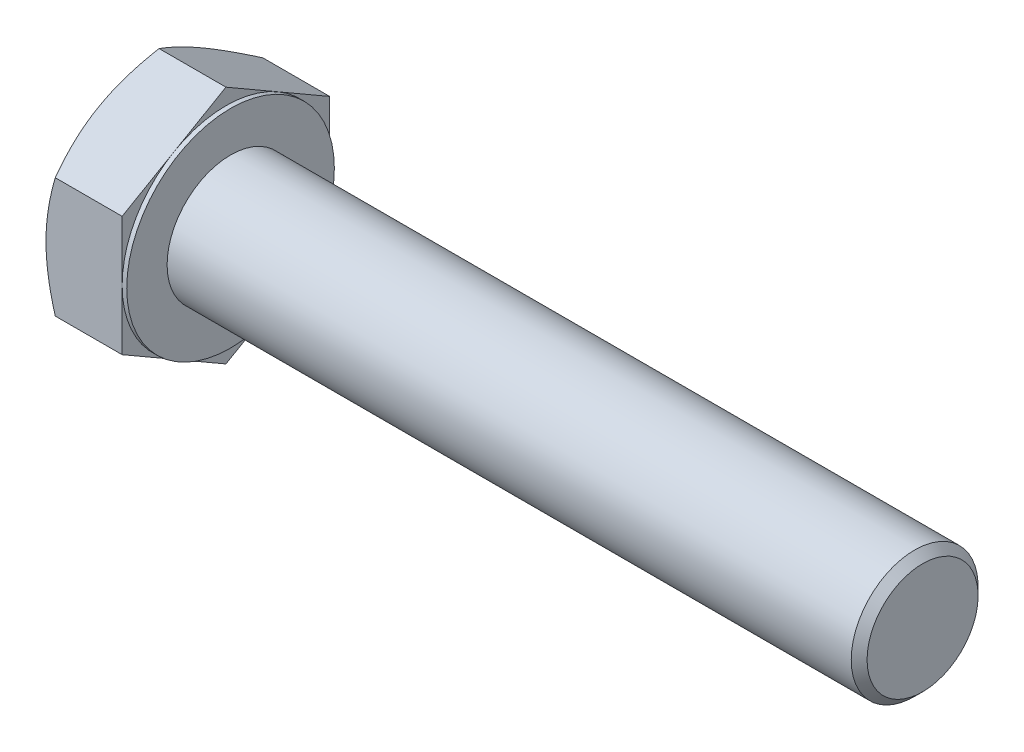
ISO-10303-21;
HEADER;
FILE_DESCRIPTION(('STEP AP214'),'2;1');
FILE_NAME('part.step','',(''),(''),'','','');
FILE_SCHEMA(('AUTOMOTIVE_DESIGN { 1 0 10303 214 1 1 1 1 }'));
ENDSEC;
DATA;
#1=APPLICATION_CONTEXT('core data for automotive mechanical design processes');
#2=APPLICATION_PROTOCOL_DEFINITION('international standard','automotive_design',2000,#1);
#3=PRODUCT_CONTEXT('',#1,'mechanical');
#4=PRODUCT('Part','Part','',(#3));
#5=PRODUCT_RELATED_PRODUCT_CATEGORY('part','',(#4));
#6=PRODUCT_DEFINITION_FORMATION('','',#4);
#7=PRODUCT_DEFINITION_CONTEXT('part definition',#1,'design');
#8=PRODUCT_DEFINITION('design','',#6,#7);
#9=PRODUCT_DEFINITION_SHAPE('','',#8);
#10=(LENGTH_UNIT() NAMED_UNIT(*) SI_UNIT(.MILLI.,.METRE.));
#11=(NAMED_UNIT(*) PLANE_ANGLE_UNIT() SI_UNIT($,.RADIAN.));
#12=(NAMED_UNIT(*) SI_UNIT($,.STERADIAN.) SOLID_ANGLE_UNIT());
#13=UNCERTAINTY_MEASURE_WITH_UNIT(LENGTH_MEASURE(1.E-05),#10,'distance_accuracy_value','');
#14=(GEOMETRIC_REPRESENTATION_CONTEXT(3) GLOBAL_UNCERTAINTY_ASSIGNED_CONTEXT((#13)) GLOBAL_UNIT_ASSIGNED_CONTEXT((#10,
#11,#12)) REPRESENTATION_CONTEXT('',''));
#15=CARTESIAN_POINT('',(0.,0.,0.));
#16=DIRECTION('',(0.,0.,1.));
#17=DIRECTION('',(1.,0.,0.));
#18=AXIS2_PLACEMENT_3D('',#15,#16,#17);
#19=CARTESIAN_POINT('',(14.,20.7846096908265,0.));
#20=DIRECTION('',(1.,0.,0.));
#21=DIRECTION('',(0.,0.,-1.));
#22=AXIS2_PLACEMENT_3D('',#19,#20,#21);
#23=PLANE('',#22);
#24=CARTESIAN_POINT('',(14.,0.,0.));
#25=DIRECTION('',(1.,0.,0.));
#26=DIRECTION('',(0.,0.,-1.));
#27=AXIS2_PLACEMENT_3D('',#24,#25,#26);
#28=CIRCLE('',#27,11.);
#29=CARTESIAN_POINT('',(14.,0.,-11.));
#30=VERTEX_POINT('',#29);
#31=EDGE_CURVE('E273',#30,#30,#28,.F.);
#32=ORIENTED_EDGE('',*,*,#31,.T.);
#33=EDGE_LOOP('',(#32));
#34=FACE_BOUND('',#33,.T.);
#35=CARTESIAN_POINT('',(14.,0.,0.));
#36=DIRECTION('',(1.,0.,0.));
#37=DIRECTION('',(0.,0.,-1.));
#38=AXIS2_PLACEMENT_3D('',#35,#36,#37);
#39=CIRCLE('',#38,18.);
#40=CARTESIAN_POINT('',(14.,0.,-18.));
#41=VERTEX_POINT('',#40);
#42=EDGE_CURVE('E292',#41,#41,#39,.T.);
#43=ORIENTED_EDGE('',*,*,#42,.T.);
#44=EDGE_LOOP('',(#43));
#45=FACE_BOUND('',#44,.T.);
#46=ADVANCED_FACE('F35',(#34,#45),#23,.T.);
#47=CARTESIAN_POINT('',(0.,0.,0.));
#48=DIRECTION('',(-1.,0.,0.));
#49=DIRECTION('',(0.,0.,1.));
#50=AXIS2_PLACEMENT_3D('',#47,#48,#49);
#51=CYLINDRICAL_SURFACE('',#50,11.);
#52=ORIENTED_EDGE('',*,*,#31,.F.);
#53=EDGE_LOOP('',(#52));
#54=FACE_BOUND('',#53,.T.);
#55=CARTESIAN_POINT('',(132.626,0.,0.));
#56=DIRECTION('',(-1.,0.,0.));
#57=DIRECTION('',(0.,0.,1.));
#58=AXIS2_PLACEMENT_3D('',#55,#56,#57);
#59=CIRCLE('',#58,11.);
#60=CARTESIAN_POINT('',(132.626,0.,11.));
#61=VERTEX_POINT('',#60);
#62=EDGE_CURVE('E270',#61,#61,#59,.T.);
#63=ORIENTED_EDGE('',*,*,#62,.T.);
#64=EDGE_LOOP('',(#63));
#65=FACE_BOUND('',#64,.T.);
#66=ADVANCED_FACE('F244',(#54,#65),#51,.T.);
#67=CARTESIAN_POINT('',(134.,0.,0.));
#68=DIRECTION('',(-1.,0.,0.));
#69=DIRECTION('',(0.,0.,1.));
#70=AXIS2_PLACEMENT_3D('',#67,#68,#69);
#71=CONICAL_SURFACE('',#70,9.626,0.785398163397433);
#72=ORIENTED_EDGE('',*,*,#62,.F.);
#73=EDGE_LOOP('',(#72));
#74=FACE_BOUND('',#73,.T.);
#75=CARTESIAN_POINT('',(134.,0.,0.));
#76=DIRECTION('',(-1.,0.,0.));
#77=DIRECTION('',(0.,0.,1.));
#78=AXIS2_PLACEMENT_3D('',#75,#76,#77);
#79=CIRCLE('',#78,9.626);
#80=CARTESIAN_POINT('',(134.,0.,9.626));
#81=VERTEX_POINT('',#80);
#82=EDGE_CURVE('E268',#81,#81,#79,.T.);
#83=ORIENTED_EDGE('',*,*,#82,.T.);
#84=EDGE_LOOP('',(#83));
#85=FACE_BOUND('',#84,.T.);
#86=ADVANCED_FACE('F249',(#74,#85),#71,.T.);
#87=CARTESIAN_POINT('',(134.,0.,0.));
#88=DIRECTION('',(-1.,0.,0.));
#89=DIRECTION('',(0.,0.,1.));
#90=AXIS2_PLACEMENT_3D('',#87,#88,#89);
#91=PLANE('',#90);
#92=ORIENTED_EDGE('',*,*,#82,.F.);
#93=EDGE_LOOP('',(#92));
#94=FACE_BOUND('',#93,.T.);
#95=ADVANCED_FACE('F256',(#94),#91,.F.);
#96=CARTESIAN_POINT('',(13.2,18.,0.));
#97=DIRECTION('',(1.,0.,0.));
#98=DIRECTION('',(0.,0.,-1.));
#99=AXIS2_PLACEMENT_3D('',#96,#97,#98);
#100=PLANE('',#99);
#101=DIRECTION('',(0.,0.500000000000001,0.866025403784438));
#102=VECTOR('',#101,1.);
#103=CARTESIAN_POINT('',(13.2,10.3923048454133,-18.));
#104=LINE('',#103,#102);
#105=CARTESIAN_POINT('',(13.2,10.3923048454133,-18.));
#106=VERTEX_POINT('',#105);
#107=CARTESIAN_POINT('',(13.2,15.5884572681199,-9.00000000000001));
#108=VERTEX_POINT('',#107);
#109=EDGE_CURVE('E168',#106,#108,#104,.T.);
#110=ORIENTED_EDGE('',*,*,#109,.T.);
#111=CARTESIAN_POINT('',(13.2,0.,0.));
#112=DIRECTION('',(-1.,0.,0.));
#113=DIRECTION('',(0.,0.,1.));
#114=AXIS2_PLACEMENT_3D('',#111,#112,#113);
#115=CIRCLE('',#114,18.);
#116=CARTESIAN_POINT('',(13.2,0.,-18.));
#117=VERTEX_POINT('',#116);
#118=EDGE_CURVE('E51',#108,#117,#115,.T.);
#119=ORIENTED_EDGE('',*,*,#118,.T.);
#120=DIRECTION('',(0.,1.,0.));
#121=VECTOR('',#120,1.);
#122=CARTESIAN_POINT('',(13.2,10.3923048454133,-18.));
#123=LINE('',#122,#121);
#124=EDGE_CURVE('E40',#117,#106,#123,.T.);
#125=ORIENTED_EDGE('',*,*,#124,.T.);
#126=EDGE_LOOP('',(#110,#119,#125));
#127=FACE_BOUND('',#126,.T.);
#128=ADVANCED_FACE('F259',(#127),#100,.T.);
#129=CARTESIAN_POINT('',(13.2,20.7846096908265,0.));
#130=VERTEX_POINT('',#129);
#131=EDGE_CURVE('E166',#108,#130,#104,.T.);
#132=ORIENTED_EDGE('',*,*,#131,.T.);
#133=DIRECTION('',(0.,-0.500000000000001,0.866025403784438));
#134=VECTOR('',#133,1.);
#135=CARTESIAN_POINT('',(13.2,20.7846096908265,0.));
#136=LINE('',#135,#134);
#137=CARTESIAN_POINT('',(13.2,15.5884572681199,9.00000000000001));
#138=VERTEX_POINT('',#137);
#139=EDGE_CURVE('E165',#130,#138,#136,.T.);
#140=ORIENTED_EDGE('',*,*,#139,.T.);
#141=EDGE_CURVE('E154',#138,#108,#115,.T.);
#142=ORIENTED_EDGE('',*,*,#141,.T.);
#143=EDGE_LOOP('',(#132,#140,#142));
#144=FACE_BOUND('',#143,.T.);
#145=ADVANCED_FACE('F264',(#144),#100,.T.);
#146=CARTESIAN_POINT('',(13.2,10.3923048454133,18.));
#147=VERTEX_POINT('',#146);
#148=EDGE_CURVE('E133',#138,#147,#136,.T.);
#149=ORIENTED_EDGE('',*,*,#148,.T.);
#150=DIRECTION('',(0.,-1.,0.));
#151=VECTOR('',#150,1.);
#152=CARTESIAN_POINT('',(13.2,10.3923048454133,18.));
#153=LINE('',#152,#151);
#154=CARTESIAN_POINT('',(13.2,0.,18.));
#155=VERTEX_POINT('',#154);
#156=EDGE_CURVE('E127',#147,#155,#153,.T.);
#157=ORIENTED_EDGE('',*,*,#156,.T.);
#158=EDGE_CURVE('E131',#155,#138,#115,.T.);
#159=ORIENTED_EDGE('',*,*,#158,.T.);
#160=EDGE_LOOP('',(#149,#157,#159));
#161=FACE_BOUND('',#160,.T.);
#162=ADVANCED_FACE('F129',(#161),#100,.T.);
#163=CARTESIAN_POINT('',(13.2,-10.3923048454133,18.));
#164=VERTEX_POINT('',#163);
#165=EDGE_CURVE('E137',#155,#164,#153,.T.);
#166=ORIENTED_EDGE('',*,*,#165,.T.);
#167=DIRECTION('',(0.,-0.500000000000001,-0.866025403784438));
#168=VECTOR('',#167,1.);
#169=CARTESIAN_POINT('',(13.2,-20.7846096908266,0.));
#170=LINE('',#169,#168);
#171=CARTESIAN_POINT('',(13.2,-15.5884572681199,9.00000000000002));
#172=VERTEX_POINT('',#171);
#173=EDGE_CURVE('E144',#164,#172,#170,.T.);
#174=ORIENTED_EDGE('',*,*,#173,.T.);
#175=EDGE_CURVE('E141',#172,#155,#115,.T.);
#176=ORIENTED_EDGE('',*,*,#175,.T.);
#177=EDGE_LOOP('',(#166,#174,#176));
#178=FACE_BOUND('',#177,.T.);
#179=ADVANCED_FACE('F142',(#178),#100,.T.);
#180=CARTESIAN_POINT('',(13.2,-20.7846096908266,0.));
#181=VERTEX_POINT('',#180);
#182=EDGE_CURVE('E160',#172,#181,#170,.T.);
#183=ORIENTED_EDGE('',*,*,#182,.T.);
#184=DIRECTION('',(0.,0.500000000000001,-0.866025403784438));
#185=VECTOR('',#184,1.);
#186=CARTESIAN_POINT('',(13.2,-10.3923048454133,-18.));
#187=LINE('',#186,#185);
#188=CARTESIAN_POINT('',(13.2,-15.5884572681199,-9.00000000000001));
#189=VERTEX_POINT('',#188);
#190=EDGE_CURVE('E328',#181,#189,#187,.T.);
#191=ORIENTED_EDGE('',*,*,#190,.T.);
#192=EDGE_CURVE('E148',#189,#172,#115,.T.);
#193=ORIENTED_EDGE('',*,*,#192,.T.);
#194=EDGE_LOOP('',(#183,#191,#193));
#195=FACE_BOUND('',#194,.T.);
#196=ADVANCED_FACE('F333',(#195),#100,.T.);
#197=CARTESIAN_POINT('',(13.2,-10.3923048454133,-18.));
#198=VERTEX_POINT('',#197);
#199=EDGE_CURVE('E155',#189,#198,#187,.T.);
#200=ORIENTED_EDGE('',*,*,#199,.T.);
#201=EDGE_CURVE('E11',#198,#117,#123,.T.);
#202=ORIENTED_EDGE('',*,*,#201,.T.);
#203=EDGE_CURVE('E346',#117,#189,#115,.T.);
#204=ORIENTED_EDGE('',*,*,#203,.T.);
#205=EDGE_LOOP('',(#200,#202,#204));
#206=FACE_BOUND('',#205,.T.);
#207=ADVANCED_FACE('F265',(#206),#100,.T.);
#208=CARTESIAN_POINT('',(0.,0.,0.));
#209=DIRECTION('',(-1.,0.,0.));
#210=DIRECTION('',(0.,0.,1.));
#211=AXIS2_PLACEMENT_3D('',#208,#209,#210);
#212=CYLINDRICAL_SURFACE('',#211,18.);
#213=ORIENTED_EDGE('',*,*,#118,.F.);
#214=ORIENTED_EDGE('',*,*,#141,.F.);
#215=ORIENTED_EDGE('',*,*,#158,.F.);
#216=ORIENTED_EDGE('',*,*,#175,.F.);
#217=ORIENTED_EDGE('',*,*,#192,.F.);
#218=ORIENTED_EDGE('',*,*,#203,.F.);
#219=EDGE_LOOP('',(#213,#214,#215,#216,#217,#218));
#220=FACE_BOUND('',#219,.T.);
#221=ORIENTED_EDGE('',*,*,#42,.F.);
#222=EDGE_LOOP('',(#221));
#223=FACE_BOUND('',#222,.T.);
#224=ADVANCED_FACE('F151',(#220,#223),#212,.T.);
#225=CARTESIAN_POINT('',(0.,20.7846096908265,0.));
#226=DIRECTION('',(1.,0.,0.));
#227=DIRECTION('',(0.,0.,-1.));
#228=AXIS2_PLACEMENT_3D('',#225,#226,#227);
#229=PLANE('',#228);
#230=CARTESIAN_POINT('',(0.,0.,0.));
#231=DIRECTION('',(1.,0.,0.));
#232=DIRECTION('',(0.,0.,-1.));
#233=AXIS2_PLACEMENT_3D('',#230,#231,#232);
#234=CIRCLE('',#233,18.);
#235=CARTESIAN_POINT('',(0.,0.,-18.));
#236=VERTEX_POINT('',#235);
#237=CARTESIAN_POINT('',(0.,15.5884572681199,-9.00000000000001));
#238=VERTEX_POINT('',#237);
#239=EDGE_CURVE('E291',#236,#238,#234,.T.);
#240=ORIENTED_EDGE('',*,*,#239,.F.);
#241=CARTESIAN_POINT('',(0.,-15.5884572681199,-9.00000000000001));
#242=VERTEX_POINT('',#241);
#243=EDGE_CURVE('E288',#242,#236,#234,.T.);
#244=ORIENTED_EDGE('',*,*,#243,.F.);
#245=CARTESIAN_POINT('',(0.,-15.5884572681199,9.00000000000001));
#246=VERTEX_POINT('',#245);
#247=EDGE_CURVE('E290',#246,#242,#234,.T.);
#248=ORIENTED_EDGE('',*,*,#247,.F.);
#249=CARTESIAN_POINT('',(0.,0.,18.));
#250=VERTEX_POINT('',#249);
#251=EDGE_CURVE('E300',#250,#246,#234,.T.);
#252=ORIENTED_EDGE('',*,*,#251,.F.);
#253=CARTESIAN_POINT('',(0.,0.,0.));
#254=DIRECTION('',(-1.,0.,0.));
#255=DIRECTION('',(0.,0.,1.));
#256=AXIS2_PLACEMENT_3D('',#253,#254,#255);
#257=CIRCLE('',#256,18.);
#258=CARTESIAN_POINT('',(0.,15.5884572681199,9.00000000000001));
#259=VERTEX_POINT('',#258);
#260=EDGE_CURVE('E169',#250,#259,#257,.T.);
#261=ORIENTED_EDGE('',*,*,#260,.T.);
#262=EDGE_CURVE('E295',#238,#259,#234,.T.);
#263=ORIENTED_EDGE('',*,*,#262,.F.);
#264=EDGE_LOOP('',(#240,#244,#248,#252,#261,#263));
#265=FACE_BOUND('',#264,.T.);
#266=ADVANCED_FACE('F198',(#265),#229,.F.);
#267=CARTESIAN_POINT('',(0.,0.,0.));
#268=DIRECTION('',(1.,0.,0.));
#269=DIRECTION('',(0.,0.,-1.));
#270=AXIS2_PLACEMENT_3D('',#267,#268,#269);
#271=CONICAL_SURFACE('',#270,18.,1.0471975511966);
#272=CARTESIAN_POINT('',(1.60776182180894,10.3921893753594,18.0002));
#273=CARTESIAN_POINT('',(1.47589336556313,10.6206079566545,17.6045674118041));
#274=CARTESIAN_POINT('',(1.35000889021179,10.8499174930169,17.2073916441644));
#275=CARTESIAN_POINT('',(1.11187123611098,11.310375356009,16.4098552307175));
#276=CARTESIAN_POINT('',(0.999622540659328,11.5415242609305,16.0094935832795));
#277=CARTESIAN_POINT('',(0.790265297583964,12.0061075993295,15.2048116368224));
#278=CARTESIAN_POINT('',(0.693192573141012,12.2395460983593,14.8004842960602));
#279=CARTESIAN_POINT('',(0.516271743787662,12.7080451523823,13.9890201311945));
#280=CARTESIAN_POINT('',(0.436422652420741,12.9431056136839,13.5818834693696));
#281=CARTESIAN_POINT('',(0.297345302854858,13.4088255484441,12.7752328802672));
#282=CARTESIAN_POINT('',(0.237656723113627,13.6394504469968,12.3757788384836));
#283=CARTESIAN_POINT('',(0.13757237566945,14.1017570002651,11.5750403995507));
#284=CARTESIAN_POINT('',(0.0971769793251384,14.3334386752352,11.1737559673198));
#285=CARTESIAN_POINT('',(0.0366989588175672,14.7971912077607,10.370513018847));
#286=CARTESIAN_POINT('',(0.016592197038854,15.0292612730516,9.96855587484737));
#287=CARTESIAN_POINT('',(-0.00287614600258716,15.4936156120144,9.16427056704863));
#288=CARTESIAN_POINT('',(-0.00223836829112098,15.7258998788456,8.76194241509821));
#289=CARTESIAN_POINT('',(0.018333579496385,16.1601606713826,8.00978065868889));
#290=CARTESIAN_POINT('',(0.0357591844006531,16.3621681381522,7.65989346273577));
#291=CARTESIAN_POINT('',(0.0859690685012238,16.765701206145,6.96095368643809));
#292=CARTESIAN_POINT('',(0.118753127736275,16.9672268142278,6.61190109421242));
#293=CARTESIAN_POINT('',(0.199111057578687,17.3697198122039,5.91476277202716));
#294=CARTESIAN_POINT('',(0.246698302564832,17.5706865308241,5.56667820474646));
#295=CARTESIAN_POINT('',(0.355822876567444,17.9716632799777,4.87216610255867));
#296=CARTESIAN_POINT('',(0.417360146472637,18.1716733145612,4.52573856063651));
#297=CARTESIAN_POINT('',(0.624462075708565,18.7788295665707,3.47411308402299));
#298=CARTESIAN_POINT('',(0.790677467933148,19.1842175215698,2.77196054918802));
#299=CARTESIAN_POINT('',(1.1679181702988,19.9889486858692,1.37812528618742));
#300=CARTESIAN_POINT('',(1.3788548871277,20.3883021980098,0.686424712978887));
#301=CARTESIAN_POINT('',(1.60776182180895,20.7847251608804,-0.000199999999999422));
#302=B_SPLINE_CURVE_WITH_KNOTS('',3,(#272,#273,#274,#275,#276,#277,#278,#279,#280,#281,#282,
#283,#284,#285,#286,#287,#288,#289,#290,#291,#292,#293,#294,#295,#296,#297,#298,#299,#300,#301),
.UNSPECIFIED.,.F.,.F.,(4,2,2,2,2,2,2,2,2,2,2,2,2,2,4),(0.,1.42650335783821,2.85347447244912,
4.28376471280637,5.71397301377358,7.10888071673008,8.5038152680368,9.8970882864255,
11.2903182514067,12.5031974791544,13.7160593367767,14.9300201888636,16.1439758970578,
18.6253607678546,21.1018751738864),.UNSPECIFIED.);
#303=CARTESIAN_POINT('',(1.60769515458674,20.7846096908265,0.));
#304=VERTEX_POINT('',#303);
#305=EDGE_CURVE('E216',#259,#304,#302,.T.);
#306=ORIENTED_EDGE('',*,*,#305,.T.);
#307=CARTESIAN_POINT('',(1.60776182180895,20.7847251608804,0.0002));
#308=CARTESIAN_POINT('',(1.47589336556314,20.5563065795853,-0.39543258819589));
#309=CARTESIAN_POINT('',(1.3500088902118,20.3269970432229,-0.792608355835561));
#310=CARTESIAN_POINT('',(1.11187123611099,19.8665391802308,-1.59014476928247));
#311=CARTESIAN_POINT('',(0.999622540659338,19.6353902753093,-1.99050641672051));
#312=CARTESIAN_POINT('',(0.790265297583974,19.1708069369103,-2.79518836317755));
#313=CARTESIAN_POINT('',(0.693192573141022,18.9373684378805,-3.19951570393979));
#314=CARTESIAN_POINT('',(0.516271743787671,18.4688693838575,-4.01097986880547));
#315=CARTESIAN_POINT('',(0.436422652420748,18.2338089225559,-4.41811653063043));
#316=CARTESIAN_POINT('',(0.297345302854863,17.7680889877957,-5.22476711973284));
#317=CARTESIAN_POINT('',(0.237656723113632,17.537464089243,-5.62422116151643));
#318=CARTESIAN_POINT('',(0.137572375669453,17.0751575359747,-6.42495960044929));
#319=CARTESIAN_POINT('',(0.0971769793251405,16.8434758610046,-6.82624403268018));
#320=CARTESIAN_POINT('',(0.0366989588175682,16.3797233284791,-7.62948698115295));
#321=CARTESIAN_POINT('',(0.0165921970388556,16.1476532631882,-8.03144412515262));
#322=CARTESIAN_POINT('',(-0.00287614600258678,15.6832989242254,-8.83572943295137));
#323=CARTESIAN_POINT('',(-0.00223836829112223,15.4510146573942,-9.23805758490179));
#324=CARTESIAN_POINT('',(0.0183335794963823,15.0167538648572,-9.99021934131111));
#325=CARTESIAN_POINT('',(0.0357591844006503,14.8147463980876,-10.3401065372642));
#326=CARTESIAN_POINT('',(0.0859690685012205,14.4112133300948,-11.0390463135619));
#327=CARTESIAN_POINT('',(0.118753127736271,14.209687722012,-11.3880989057876));
#328=CARTESIAN_POINT('',(0.199111057578683,13.8071947240359,-12.0852372279728));
#329=CARTESIAN_POINT('',(0.246698302564828,13.6062280054157,-12.4333217952535));
#330=CARTESIAN_POINT('',(0.355822876567439,13.2052512562621,-13.1278338974413));
#331=CARTESIAN_POINT('',(0.417360146472629,13.0052412216786,-13.4742614393635));
#332=CARTESIAN_POINT('',(0.624462075708554,12.3980849696691,-14.525886915977));
#333=CARTESIAN_POINT('',(0.790677467933137,11.99269701467,-15.228039450812));
#334=CARTESIAN_POINT('',(1.16791817029879,11.1879658503706,-16.6218747138126));
#335=CARTESIAN_POINT('',(1.37885488712769,10.78861233823,-17.3135752870211));
#336=CARTESIAN_POINT('',(1.60776182180894,10.3921893753594,-18.0002));
#337=B_SPLINE_CURVE_WITH_KNOTS('',3,(#307,#308,#309,#310,#311,#312,#313,#314,#315,#316,#317,
#318,#319,#320,#321,#322,#323,#324,#325,#326,#327,#328,#329,#330,#331,#332,#333,#334,#335,#336),
.UNSPECIFIED.,.F.,.F.,(4,2,2,2,2,2,2,2,2,2,2,2,2,2,4),(0.,1.42650335783821,2.85347447244912,
4.28376471280638,5.71397301377359,7.10888071673009,8.50381526803681,9.8970882864255,
11.2903182514068,12.5031974791544,13.7160593367768,14.9300201888636,16.1439758970578,
18.6253607678546,21.1018751738864),.UNSPECIFIED.);
#338=EDGE_CURVE('E59',#304,#238,#337,.T.);
#339=ORIENTED_EDGE('',*,*,#338,.T.);
#340=ORIENTED_EDGE('',*,*,#262,.T.);
#341=EDGE_LOOP('',(#306,#339,#340));
#342=FACE_BOUND('',#341,.T.);
#343=ADVANCED_FACE('F342',(#342),#271,.T.);
#344=CARTESIAN_POINT('',(8.80842713097471,-27.9643402440907,18.));
#345=CARTESIAN_POINT('',(8.61750677849099,-27.5710662083654,18.));
#346=CARTESIAN_POINT('',(8.42753472778146,-27.1773320242562,18.));
#347=CARTESIAN_POINT('',(8.04970189935704,-26.3888473529655,18.));
#348=CARTESIAN_POINT('',(7.86184114273206,-25.9940968556801,18.));
#349=CARTESIAN_POINT('',(7.30169863386395,-24.8080724642775,18.));
#350=CARTESIAN_POINT('',(6.93291289437432,-24.0151412260899,18.));
#351=CARTESIAN_POINT('',(6.20490967187156,-22.4196974035044,18.));
#352=CARTESIAN_POINT('',(5.84575478315001,-21.6171561889331,18.));
#353=CARTESIAN_POINT('',(5.1420706468777,-20.0057089280707,18.));
#354=CARTESIAN_POINT('',(4.79754071174434,-19.196803183128,18.));
#355=CARTESIAN_POINT('',(4.11611022279456,-17.5450041871963,18.));
#356=CARTESIAN_POINT('',(3.7798180950293,-16.7018586275441,18.));
#357=CARTESIAN_POINT('',(3.1325651480111,-15.005715432528,18.));
#358=CARTESIAN_POINT('',(2.82160716503417,-14.1527167062286,18.));
#359=CARTESIAN_POINT('',(2.23315455027017,-12.4371186738844,18.));
#360=CARTESIAN_POINT('',(1.95559259445028,-11.5745426463558,18.));
#361=CARTESIAN_POINT('',(1.44279031202514,-9.83693542734509,18.));
#362=CARTESIAN_POINT('',(1.20753670688335,-8.96190823704618,18.));
#363=CARTESIAN_POINT('',(0.895522308081284,-7.64230427811238,18.));
#364=CARTESIAN_POINT('',(0.798539960323232,-7.20248011875152,18.));
#365=CARTESIAN_POINT('',(0.619346663982094,-6.31981731440451,18.));
#366=CARTESIAN_POINT('',(0.537135413908953,-5.87697873113671,18.));
#367=CARTESIAN_POINT('',(0.388933808111684,-4.988597027818,18.));
#368=CARTESIAN_POINT('',(0.322942911230493,-4.54305399850342,18.));
#369=CARTESIAN_POINT('',(0.208492383558029,-3.64970631084203,18.));
#370=CARTESIAN_POINT('',(0.1600327413294,-3.2019016539709,18.));
#371=CARTESIAN_POINT('',(0.0822220075103934,-2.31054962915722,18.));
#372=CARTESIAN_POINT('',(0.052628371700907,-1.86702356450905,18.));
#373=CARTESIAN_POINT('',(0.0122265392038568,-0.979118128574119,18.));
#374=CARTESIAN_POINT('',(0.00141802962903811,-0.534738771623319,18.));
#375=CARTESIAN_POINT('',(-0.00115631761626654,0.354079707284697,18.));
#376=CARTESIAN_POINT('',(0.00707792062379335,0.798518829473095,18.));
#377=CARTESIAN_POINT('',(0.0423876675602117,1.68665283547366,18.));
#378=CARTESIAN_POINT('',(0.0694640211674184,2.13034768501706,18.));
#379=CARTESIAN_POINT('',(0.156482092986642,3.19520589130289,18.));
#380=CARTESIAN_POINT('',(0.225281528451192,3.81565824233054,18.));
#381=CARTESIAN_POINT('',(0.395990058481247,5.05199420629768,18.));
#382=CARTESIAN_POINT('',(0.497903614697511,5.66787719213724,18.));
#383=CARTESIAN_POINT('',(0.731215030447438,6.89447554343314,18.));
#384=CARTESIAN_POINT('',(0.86263576958385,7.50518651517417,18.));
#385=CARTESIAN_POINT('',(1.15094813722315,8.72049972428945,18.));
#386=CARTESIAN_POINT('',(1.30783938963271,9.32510205172292,18.));
#387=CARTESIAN_POINT('',(1.64698004801114,10.5414936476874,18.));
#388=CARTESIAN_POINT('',(1.82971242014998,11.1531473236693,18.));
#389=CARTESIAN_POINT('',(2.21414736103885,12.3704299759813,18.));
#390=CARTESIAN_POINT('',(2.4158500545846,12.9760589126488,18.));
#391=CARTESIAN_POINT('',(2.83501520678354,14.1815895187405,18.));
#392=CARTESIAN_POINT('',(3.05247247546213,14.781493001241,18.));
#393=CARTESIAN_POINT('',(3.50057968381538,15.9763233436138,18.));
#394=CARTESIAN_POINT('',(3.73122947173864,16.5712502606407,18.));
#395=CARTESIAN_POINT('',(4.28861115056411,17.9702204866667,18.));
#396=CARTESIAN_POINT('',(4.62002515688316,18.7723954689383,18.));
#397=CARTESIAN_POINT('',(5.29890820173807,20.3699430833353,18.));
#398=CARTESIAN_POINT('',(5.64637822370813,21.1653152952441,18.));
#399=CARTESIAN_POINT('',(6.3541728667099,22.750516728457,18.));
#400=CARTESIAN_POINT('',(6.71450033452646,23.5403446752873,18.));
#401=CARTESIAN_POINT('',(7.44542750488467,25.1152008422836,18.));
#402=CARTESIAN_POINT('',(7.81602698959445,25.9002291638017,18.));
#403=CARTESIAN_POINT('',(8.56599428657224,27.4671332627904,18.));
#404=CARTESIAN_POINT('',(8.94537123397526,28.2490046603126,18.));
#405=CARTESIAN_POINT('',(9.71100797406294,29.8093695501392,18.));
#406=CARTESIAN_POINT('',(10.0972677961479,30.5878630279972,18.));
#407=CARTESIAN_POINT('',(10.8754456136253,32.1418914557266,18.));
#408=CARTESIAN_POINT('',(11.2673628913496,32.9174267653441,18.));
#409=CARTESIAN_POINT('',(12.0559785806139,34.4660583577795,18.));
#410=CARTESIAN_POINT('',(12.4526769833034,35.239154645109,18.));
#411=CARTESIAN_POINT('',(13.5822142017647,37.4263866626178,18.));
#412=CARTESIAN_POINT('',(14.3197969564006,38.8380724755442,18.));
#413=CARTESIAN_POINT('',(15.805065533254,41.656170008256,18.));
#414=CARTESIAN_POINT('',(16.5527517109513,43.062581540235,18.));
#415=CARTESIAN_POINT('',(18.0539928577398,45.8677641359459,18.));
#416=CARTESIAN_POINT('',(18.8075285856065,47.2665455040334,18.));
#417=CARTESIAN_POINT('',(19.9423345313063,49.362227066156,18.));
#418=CARTESIAN_POINT('',(20.3213432728994,50.0603536797457,18.));
#419=CARTESIAN_POINT('',(21.0807116464631,51.4558704719676,18.));
#420=CARTESIAN_POINT('',(21.4610712763196,52.1532606517503,18.));
#421=CARTESIAN_POINT('',(21.8420286719472,52.8503242367094,18.));
#422=B_SPLINE_CURVE_WITH_KNOTS('',3,(#344,#345,#346,#347,#348,#349,#350,#351,#352,#353,#354,
#355,#356,#357,#358,#359,#360,#361,#362,#363,#364,#365,#366,#367,#368,#369,#370,#371,#372,#373,
#374,#375,#376,#377,#378,#379,#380,#381,#382,#383,#384,#385,#386,#387,#388,#389,#390,#391,#392,
#393,#394,#395,#396,#397,#398,#399,#400,#401,#402,#403,#404,#405,#406,#407,#408,#409,#410,#411,
#412,#413,#414,#415,#416,#417,#418,#419,#420,#421),.UNSPECIFIED.,.F.,.F.,(4,2,2,2,2,2,2,2,2,2,2,
2,2,2,2,2,2,2,2,2,2,2,2,2,2,2,2,2,2,2,2,2,2,2,2,2,2,2,4),(0.,1.31149885288839,2.62301079484386,
5.24642021637563,7.88402931877024,10.5215142780472,13.244415033115,15.9676202119508,
18.6852402005458,21.4020057660261,22.7529669029715,24.1039004625739,25.4547889450755,
26.8056765462585,28.138826747742,29.4719547439074,30.8050880543609,32.1382811485151,
34.0100119565044,35.8819950579051,37.7554347218344,39.6288467253831,41.5435776039908,
43.4583210794826,45.3724366309638,47.2865301691098,49.8901135961075,52.4938567050458,
55.0981799338023,57.70244797659,60.3095605501759,62.9166842627348,65.5234801091398,
68.1302711308122,72.9084899139355,77.6868772543136,82.4533702935725,84.8364880623258,
87.219602103019),.UNSPECIFIED.);
#423=CARTESIAN_POINT('',(1.60769515458672,10.3923048454133,18.));
#424=VERTEX_POINT('',#423);
#425=EDGE_CURVE('E228',#250,#424,#422,.T.);
#426=ORIENTED_EDGE('',*,*,#425,.T.);
#427=EDGE_CURVE('E227',#424,#259,#302,.T.);
#428=ORIENTED_EDGE('',*,*,#427,.T.);
#429=ORIENTED_EDGE('',*,*,#260,.F.);
#430=EDGE_LOOP('',(#426,#428,#429));
#431=FACE_BOUND('',#430,.T.);
#432=ADVANCED_FACE('F338',(#431),#271,.T.);
#433=CARTESIAN_POINT('',(1.60769515458673,-10.3923048454133,18.));
#434=VERTEX_POINT('',#433);
#435=EDGE_CURVE('E271',#434,#250,#422,.T.);
#436=ORIENTED_EDGE('',*,*,#435,.T.);
#437=ORIENTED_EDGE('',*,*,#251,.T.);
#438=CARTESIAN_POINT('',(1.60776182180897,-20.7847251608804,-0.00019999999999998));
#439=CARTESIAN_POINT('',(1.47589336556315,-20.5563065795853,0.395432588195888));
#440=CARTESIAN_POINT('',(1.35000889021182,-20.326997043223,0.79260835583556));
#441=CARTESIAN_POINT('',(1.111871236111,-19.8665391802309,1.59014476928247));
#442=CARTESIAN_POINT('',(0.999622540659351,-19.6353902753093,1.99050641672052));
#443=CARTESIAN_POINT('',(0.790265297583985,-19.1708069369103,2.79518836317755));
#444=CARTESIAN_POINT('',(0.693192573141032,-18.9373684378805,3.19951570393979));
#445=CARTESIAN_POINT('',(0.516271743787681,-18.4688693838575,4.01097986880548));
#446=CARTESIAN_POINT('',(0.436422652420759,-18.2338089225559,4.41811653063043));
#447=CARTESIAN_POINT('',(0.297345302854876,-17.7680889877957,5.22476711973285));
#448=CARTESIAN_POINT('',(0.237656723113645,-17.5374640892431,5.62422116151643));
#449=CARTESIAN_POINT('',(0.137572375669466,-17.0751575359747,6.4249596004493));
#450=CARTESIAN_POINT('',(0.0971769793251524,-16.8434758610046,6.82624403268019));
#451=CARTESIAN_POINT('',(0.0366989588175788,-16.3797233284791,7.62948698115296));
#452=CARTESIAN_POINT('',(0.0165921970388654,-16.1476532631882,8.03144412515263));
#453=CARTESIAN_POINT('',(-0.00287614600257658,-15.6832989242254,8.83572943295138));
#454=CARTESIAN_POINT('',(-0.00223836829111089,-15.4510146573942,9.2380575849018));
#455=CARTESIAN_POINT('',(0.0183335794963948,-15.0167538648572,9.99021934131112));
#456=CARTESIAN_POINT('',(0.035759184400663,-14.8147463980876,10.3401065372642));
#457=CARTESIAN_POINT('',(0.0859690685012324,-14.4112133300948,11.0390463135619));
#458=CARTESIAN_POINT('',(0.118753127736282,-14.209687722012,11.3880989057876));
#459=CARTESIAN_POINT('',(0.199111057578692,-13.8071947240359,12.0852372279728));
#460=CARTESIAN_POINT('',(0.246698302564838,-13.6062280054157,12.4333217952535));
#461=CARTESIAN_POINT('',(0.355822876567449,-13.2052512562621,13.1278338974413));
#462=CARTESIAN_POINT('',(0.417360146472641,-13.0052412216786,13.4742614393635));
#463=CARTESIAN_POINT('',(0.624462075708567,-12.3980849696692,14.525886915977));
#464=CARTESIAN_POINT('',(0.790677467933148,-11.99269701467,15.228039450812));
#465=CARTESIAN_POINT('',(1.1679181702988,-11.1879658503706,16.6218747138126));
#466=CARTESIAN_POINT('',(1.3788548871277,-10.78861233823,17.3135752870211));
#467=CARTESIAN_POINT('',(1.60776182180895,-10.3921893753594,18.0002));
#468=B_SPLINE_CURVE_WITH_KNOTS('',3,(#438,#439,#440,#441,#442,#443,#444,#445,#446,#447,#448,
#449,#450,#451,#452,#453,#454,#455,#456,#457,#458,#459,#460,#461,#462,#463,#464,#465,#466,#467),
.UNSPECIFIED.,.F.,.F.,(4,2,2,2,2,2,2,2,2,2,2,2,2,2,4),(0.,1.42650335783821,2.85347447244913,
4.28376471280639,5.7139730137736,7.1088807167301,8.50381526803682,9.89708828642552,
11.2903182514068,12.5031974791545,13.7160593367768,14.9300201888636,16.1439758970578,
18.6253607678546,21.1018751738864),.UNSPECIFIED.);
#469=EDGE_CURVE('E218',#246,#434,#468,.T.);
#470=ORIENTED_EDGE('',*,*,#469,.T.);
#471=EDGE_LOOP('',(#436,#437,#470));
#472=FACE_BOUND('',#471,.T.);
#473=ADVANCED_FACE('F187',(#472),#271,.T.);
#474=CARTESIAN_POINT('',(1.60769515458675,-20.7846096908266,0.));
#475=VERTEX_POINT('',#474);
#476=EDGE_CURVE('E211',#475,#246,#468,.T.);
#477=ORIENTED_EDGE('',*,*,#476,.T.);
#478=ORIENTED_EDGE('',*,*,#247,.T.);
#479=CARTESIAN_POINT('',(1.60776182180895,-10.3921893753594,-18.0002));
#480=CARTESIAN_POINT('',(1.47589336556314,-10.6206079566545,-17.6045674118041));
#481=CARTESIAN_POINT('',(1.3500088902118,-10.8499174930169,-17.2073916441644));
#482=CARTESIAN_POINT('',(1.11187123611099,-11.310375356009,-16.4098552307175));
#483=CARTESIAN_POINT('',(0.999622540659339,-11.5415242609306,-16.0094935832795));
#484=CARTESIAN_POINT('',(0.790265297583976,-12.0061075993296,-15.2048116368225));
#485=CARTESIAN_POINT('',(0.693192573141025,-12.2395460983594,-14.8004842960602));
#486=CARTESIAN_POINT('',(0.516271743787676,-12.7080451523823,-13.9890201311945));
#487=CARTESIAN_POINT('',(0.436422652420755,-12.9431056136839,-13.5818834693696));
#488=CARTESIAN_POINT('',(0.297345302854872,-13.4088255484442,-12.7752328802672));
#489=CARTESIAN_POINT('',(0.237656723113641,-13.6394504469968,-12.3757788384836));
#490=CARTESIAN_POINT('',(0.137572375669463,-14.1017570002652,-11.5750403995507));
#491=CARTESIAN_POINT('',(0.0971769793251508,-14.3334386752353,-11.1737559673198));
#492=CARTESIAN_POINT('',(0.0366989588175803,-14.7971912077607,-10.370513018847));
#493=CARTESIAN_POINT('',(0.0165921970388688,-15.0292612730516,-9.96855587484737));
#494=CARTESIAN_POINT('',(-0.00287614600257197,-15.4936156120145,-9.16427056704862));
#495=CARTESIAN_POINT('',(-0.00223836829110717,-15.7258998788456,-8.76194241509821));
#496=CARTESIAN_POINT('',(0.0183335794963991,-16.1601606713827,-8.00978065868889));
#497=CARTESIAN_POINT('',(0.0357591844006686,-16.3621681381522,-7.65989346273577));
#498=CARTESIAN_POINT('',(0.0859690685012398,-16.765701206145,-6.96095368643808));
#499=CARTESIAN_POINT('',(0.11875312773629,-16.9672268142278,-6.61190109421242));
#500=CARTESIAN_POINT('',(0.199111057578702,-17.3697198122039,-5.91476277202716));
#501=CARTESIAN_POINT('',(0.246698302564848,-17.5706865308242,-5.56667820474646));
#502=CARTESIAN_POINT('',(0.35582287656746,-17.9716632799777,-4.87216610255867));
#503=CARTESIAN_POINT('',(0.417360146472652,-18.1716733145612,-4.52573856063651));
#504=CARTESIAN_POINT('',(0.624462075708578,-18.7788295665707,-3.47411308402299));
#505=CARTESIAN_POINT('',(0.790677467933161,-19.1842175215698,-2.77196054918801));
#506=CARTESIAN_POINT('',(1.16791817029882,-19.9889486858692,-1.37812528618742));
#507=CARTESIAN_POINT('',(1.37885488712772,-20.3883021980098,-0.686424712978886));
#508=CARTESIAN_POINT('',(1.60776182180897,-20.7847251608804,0.000199999999998893));
#509=B_SPLINE_CURVE_WITH_KNOTS('',3,(#479,#480,#481,#482,#483,#484,#485,#486,#487,#488,#489,
#490,#491,#492,#493,#494,#495,#496,#497,#498,#499,#500,#501,#502,#503,#504,#505,#506,#507,#508),
.UNSPECIFIED.,.F.,.F.,(4,2,2,2,2,2,2,2,2,2,2,2,2,2,4),(0.,1.42650335783821,2.85347447244913,
4.28376471280638,5.71397301377359,7.10888071673009,8.50381526803682,9.89708828642551,
11.2903182514068,12.5031974791545,13.7160593367768,14.9300201888636,16.1439758970578,
18.6253607678546,21.1018751738864),.UNSPECIFIED.);
#510=EDGE_CURVE('E217',#242,#475,#509,.T.);
#511=ORIENTED_EDGE('',*,*,#510,.T.);
#512=EDGE_LOOP('',(#477,#478,#511));
#513=FACE_BOUND('',#512,.T.);
#514=ADVANCED_FACE('F309',(#513),#271,.T.);
#515=CARTESIAN_POINT('',(1.60769515458672,10.3923048454133,-18.));
#516=VERTEX_POINT('',#515);
#517=EDGE_CURVE('E219',#238,#516,#337,.T.);
#518=ORIENTED_EDGE('',*,*,#517,.T.);
#519=CARTESIAN_POINT('',(8.80842713097472,-27.9643402440907,-18.));
#520=CARTESIAN_POINT('',(8.617506778491,-27.5710662083654,-18.));
#521=CARTESIAN_POINT('',(8.42753472778147,-27.1773320242562,-18.));
#522=CARTESIAN_POINT('',(8.04970189935704,-26.3888473529655,-18.));
#523=CARTESIAN_POINT('',(7.86184114273207,-25.9940968556801,-18.));
#524=CARTESIAN_POINT('',(7.30169863386396,-24.8080724642775,-18.));
#525=CARTESIAN_POINT('',(6.93291289437432,-24.0151412260899,-18.));
#526=CARTESIAN_POINT('',(6.20490967187157,-22.4196974035044,-18.));
#527=CARTESIAN_POINT('',(5.84575478315002,-21.6171561889332,-18.));
#528=CARTESIAN_POINT('',(5.14207064687771,-20.0057089280707,-18.));
#529=CARTESIAN_POINT('',(4.79754071174434,-19.196803183128,-18.));
#530=CARTESIAN_POINT('',(4.11611022279456,-17.5450041871963,-18.));
#531=CARTESIAN_POINT('',(3.7798180950293,-16.7018586275441,-18.));
#532=CARTESIAN_POINT('',(3.13256514801111,-15.005715432528,-18.));
#533=CARTESIAN_POINT('',(2.82160716503418,-14.1527167062286,-18.));
#534=CARTESIAN_POINT('',(2.23315455027018,-12.4371186738844,-18.));
#535=CARTESIAN_POINT('',(1.95559259445029,-11.5745426463558,-18.));
#536=CARTESIAN_POINT('',(1.44279031202514,-9.8369354273451,-18.));
#537=CARTESIAN_POINT('',(1.20753670688335,-8.96190823704619,-18.));
#538=CARTESIAN_POINT('',(0.895522308081286,-7.64230427811239,-18.));
#539=CARTESIAN_POINT('',(0.798539960323234,-7.20248011875153,-18.));
#540=CARTESIAN_POINT('',(0.619346663982096,-6.31981731440452,-18.));
#541=CARTESIAN_POINT('',(0.537135413908954,-5.87697873113672,-18.));
#542=CARTESIAN_POINT('',(0.388933808111687,-4.98859702781801,-18.));
#543=CARTESIAN_POINT('',(0.322942911230497,-4.54305399850343,-18.));
#544=CARTESIAN_POINT('',(0.208492383558033,-3.64970631084204,-18.));
#545=CARTESIAN_POINT('',(0.160032741329403,-3.20190165397091,-18.));
#546=CARTESIAN_POINT('',(0.0822220075103951,-2.31054962915723,-18.));
#547=CARTESIAN_POINT('',(0.0526283717009093,-1.86702356450906,-18.));
#548=CARTESIAN_POINT('',(0.0122265392038585,-0.979118128574129,-18.));
#549=CARTESIAN_POINT('',(0.00141802962903858,-0.534738771623329,-18.));
#550=CARTESIAN_POINT('',(-0.00115631761626701,0.354079707284688,-18.));
#551=CARTESIAN_POINT('',(0.00707792062379317,0.798518829473085,-18.));
#552=CARTESIAN_POINT('',(0.0423876675602119,1.68665283547365,-18.));
#553=CARTESIAN_POINT('',(0.0694640211674187,2.13034768501704,-18.));
#554=CARTESIAN_POINT('',(0.156482092986642,3.19520589130288,-18.));
#555=CARTESIAN_POINT('',(0.22528152845119,3.81565824233052,-18.));
#556=CARTESIAN_POINT('',(0.395990058481245,5.05199420629767,-18.));
#557=CARTESIAN_POINT('',(0.49790361469751,5.66787719213723,-18.));
#558=CARTESIAN_POINT('',(0.731215030447438,6.89447554343313,-18.));
#559=CARTESIAN_POINT('',(0.86263576958385,7.50518651517416,-18.));
#560=CARTESIAN_POINT('',(1.15094813722315,8.72049972428944,-18.));
#561=CARTESIAN_POINT('',(1.30783938963271,9.32510205172292,-18.));
#562=CARTESIAN_POINT('',(1.64698004801114,10.5414936476874,-18.));
#563=CARTESIAN_POINT('',(1.82971242014998,11.1531473236693,-18.));
#564=CARTESIAN_POINT('',(2.21414736103885,12.3704299759813,-18.));
#565=CARTESIAN_POINT('',(2.4158500545846,12.9760589126488,-18.));
#566=CARTESIAN_POINT('',(2.83501520678354,14.1815895187405,-18.));
#567=CARTESIAN_POINT('',(3.05247247546212,14.7814930012409,-18.));
#568=CARTESIAN_POINT('',(3.50057968381538,15.9763233436138,-18.));
#569=CARTESIAN_POINT('',(3.73122947173864,16.5712502606407,-18.));
#570=CARTESIAN_POINT('',(4.28861115056411,17.9702204866666,-18.));
#571=CARTESIAN_POINT('',(4.62002515688316,18.7723954689383,-18.));
#572=CARTESIAN_POINT('',(5.29890820173807,20.3699430833353,-18.));
#573=CARTESIAN_POINT('',(5.64637822370813,21.1653152952441,-18.));
#574=CARTESIAN_POINT('',(6.3541728667099,22.750516728457,-18.));
#575=CARTESIAN_POINT('',(6.71450033452646,23.5403446752873,-18.));
#576=CARTESIAN_POINT('',(7.44542750488467,25.1152008422836,-18.));
#577=CARTESIAN_POINT('',(7.81602698959445,25.9002291638017,-18.));
#578=CARTESIAN_POINT('',(8.56599428657224,27.4671332627904,-18.));
#579=CARTESIAN_POINT('',(8.94537123397526,28.2490046603126,-18.));
#580=CARTESIAN_POINT('',(9.71100797406294,29.8093695501392,-18.));
#581=CARTESIAN_POINT('',(10.0972677961478,30.5878630279972,-18.));
#582=CARTESIAN_POINT('',(10.8754456136253,32.1418914557266,-18.));
#583=CARTESIAN_POINT('',(11.2673628913496,32.9174267653441,-18.));
#584=CARTESIAN_POINT('',(12.0559785806139,34.4660583577795,-18.));
#585=CARTESIAN_POINT('',(12.4526769833034,35.239154645109,-18.));
#586=CARTESIAN_POINT('',(13.5822142017647,37.4263866626178,-18.));
#587=CARTESIAN_POINT('',(14.3197969564006,38.8380724755441,-18.));
#588=CARTESIAN_POINT('',(15.805065533254,41.656170008256,-18.));
#589=CARTESIAN_POINT('',(16.5527517109513,43.062581540235,-18.));
#590=CARTESIAN_POINT('',(18.0539928577398,45.8677641359459,-18.));
#591=CARTESIAN_POINT('',(18.8075285856065,47.2665455040334,-18.));
#592=CARTESIAN_POINT('',(19.9423345313063,49.362227066156,-18.));
#593=CARTESIAN_POINT('',(20.3213432728994,50.0603536797457,-18.));
#594=CARTESIAN_POINT('',(21.0807116464631,51.4558704719676,-18.));
#595=CARTESIAN_POINT('',(21.4610712763196,52.1532606517503,-18.));
#596=CARTESIAN_POINT('',(21.8420286719472,52.8503242367094,-18.));
#597=B_SPLINE_CURVE_WITH_KNOTS('',3,(#519,#520,#521,#522,#523,#524,#525,#526,#527,#528,#529,
#530,#531,#532,#533,#534,#535,#536,#537,#538,#539,#540,#541,#542,#543,#544,#545,#546,#547,#548,
#549,#550,#551,#552,#553,#554,#555,#556,#557,#558,#559,#560,#561,#562,#563,#564,#565,#566,#567,
#568,#569,#570,#571,#572,#573,#574,#575,#576,#577,#578,#579,#580,#581,#582,#583,#584,#585,#586,
#587,#588,#589,#590,#591,#592,#593,#594,#595,#596),.UNSPECIFIED.,.F.,.F.,(4,2,2,2,2,2,2,2,2,2,2,
2,2,2,2,2,2,2,2,2,2,2,2,2,2,2,2,2,2,2,2,2,2,2,2,2,2,2,4),(0.,1.31149885288839,2.62301079484386,
5.24642021637563,7.88402931877023,10.5215142780472,13.244415033115,15.9676202119507,
18.6852402005458,21.4020057660261,22.7529669029715,24.1039004625739,25.4547889450755,
26.8056765462585,28.138826747742,29.4719547439074,30.8050880543609,32.1382811485151,
34.0100119565044,35.8819950579051,37.7554347218344,39.6288467253831,41.5435776039908,
43.4583210794826,45.3724366309638,47.2865301691098,49.8901135961075,52.4938567050458,
55.0981799338023,57.70244797659,60.3095605501759,62.9166842627348,65.5234801091398,
68.1302711308122,72.9084899139355,77.6868772543136,82.4533702935725,84.8364880623258,
87.219602103019),.UNSPECIFIED.);
#598=EDGE_CURVE('E180',#516,#236,#597,.F.);
#599=ORIENTED_EDGE('',*,*,#598,.T.);
#600=ORIENTED_EDGE('',*,*,#239,.T.);
#601=EDGE_LOOP('',(#518,#599,#600));
#602=FACE_BOUND('',#601,.T.);
#603=ADVANCED_FACE('F323',(#602),#271,.T.);
#604=CARTESIAN_POINT('',(1.60769515458674,-10.3923048454133,-18.));
#605=VERTEX_POINT('',#604);
#606=EDGE_CURVE('E181',#605,#242,#509,.T.);
#607=ORIENTED_EDGE('',*,*,#606,.T.);
#608=ORIENTED_EDGE('',*,*,#243,.T.);
#609=EDGE_CURVE('E172',#236,#605,#597,.F.);
#610=ORIENTED_EDGE('',*,*,#609,.T.);
#611=EDGE_LOOP('',(#607,#608,#610));
#612=FACE_BOUND('',#611,.T.);
#613=ADVANCED_FACE('F196',(#612),#271,.T.);
#614=CARTESIAN_POINT('',(14.,10.3923048454133,-18.));
#615=DIRECTION('',(0.,0.,1.));
#616=DIRECTION('',(0.,-1.,0.));
#617=AXIS2_PLACEMENT_3D('',#614,#615,#616);
#618=PLANE('',#617);
#619=ORIENTED_EDGE('',*,*,#201,.F.);
#620=DIRECTION('',(-1.,0.,0.));
#621=VECTOR('',#620,1.);
#622=CARTESIAN_POINT('',(14.,-10.3923048454133,-18.));
#623=LINE('',#622,#621);
#624=EDGE_CURVE('E279',#198,#605,#623,.T.);
#625=ORIENTED_EDGE('',*,*,#624,.T.);
#626=ORIENTED_EDGE('',*,*,#609,.F.);
#627=ORIENTED_EDGE('',*,*,#598,.F.);
#628=DIRECTION('',(-1.,0.,0.));
#629=VECTOR('',#628,1.);
#630=CARTESIAN_POINT('',(14.,10.3923048454133,-18.));
#631=LINE('',#630,#629);
#632=EDGE_CURVE('E277',#106,#516,#631,.T.);
#633=ORIENTED_EDGE('',*,*,#632,.F.);
#634=ORIENTED_EDGE('',*,*,#124,.F.);
#635=EDGE_LOOP('',(#619,#625,#626,#627,#633,#634));
#636=FACE_BOUND('',#635,.T.);
#637=ADVANCED_FACE('F191',(#636),#618,.F.);
#638=CARTESIAN_POINT('',(14.,-10.3923048454133,-18.));
#639=DIRECTION('',(0.,0.866025403784438,0.500000000000001));
#640=DIRECTION('',(0.,-0.500000000000001,0.866025403784438));
#641=AXIS2_PLACEMENT_3D('',#638,#639,#640);
#642=PLANE('',#641);
#643=ORIENTED_EDGE('',*,*,#190,.F.);
#644=DIRECTION('',(-1.,0.,0.));
#645=VECTOR('',#644,1.);
#646=CARTESIAN_POINT('',(14.,-20.7846096908266,0.));
#647=LINE('',#646,#645);
#648=EDGE_CURVE('E281',#181,#475,#647,.T.);
#649=ORIENTED_EDGE('',*,*,#648,.T.);
#650=ORIENTED_EDGE('',*,*,#510,.F.);
#651=ORIENTED_EDGE('',*,*,#606,.F.);
#652=ORIENTED_EDGE('',*,*,#624,.F.);
#653=ORIENTED_EDGE('',*,*,#199,.F.);
#654=EDGE_LOOP('',(#643,#649,#650,#651,#652,#653));
#655=FACE_BOUND('',#654,.T.);
#656=ADVANCED_FACE('F195',(#655),#642,.F.);
#657=CARTESIAN_POINT('',(14.,-20.7846096908266,0.));
#658=DIRECTION('',(0.,0.866025403784438,-0.500000000000001));
#659=DIRECTION('',(0.,0.500000000000001,0.866025403784438));
#660=AXIS2_PLACEMENT_3D('',#657,#658,#659);
#661=PLANE('',#660);
#662=ORIENTED_EDGE('',*,*,#173,.F.);
#663=DIRECTION('',(-1.,0.,0.));
#664=VECTOR('',#663,1.);
#665=CARTESIAN_POINT('',(14.,-10.3923048454133,18.));
#666=LINE('',#665,#664);
#667=EDGE_CURVE('E159',#164,#434,#666,.T.);
#668=ORIENTED_EDGE('',*,*,#667,.T.);
#669=ORIENTED_EDGE('',*,*,#469,.F.);
#670=ORIENTED_EDGE('',*,*,#476,.F.);
#671=ORIENTED_EDGE('',*,*,#648,.F.);
#672=ORIENTED_EDGE('',*,*,#182,.F.);
#673=EDGE_LOOP('',(#662,#668,#669,#670,#671,#672));
#674=FACE_BOUND('',#673,.T.);
#675=ADVANCED_FACE('F203',(#674),#661,.F.);
#676=CARTESIAN_POINT('',(14.,10.3923048454133,18.));
#677=DIRECTION('',(0.,0.,-1.));
#678=DIRECTION('',(0.,1.,0.));
#679=AXIS2_PLACEMENT_3D('',#676,#677,#678);
#680=PLANE('',#679);
#681=ORIENTED_EDGE('',*,*,#156,.F.);
#682=DIRECTION('',(-1.,0.,0.));
#683=VECTOR('',#682,1.);
#684=CARTESIAN_POINT('',(14.,10.3923048454133,18.));
#685=LINE('',#684,#683);
#686=EDGE_CURVE('E284',#147,#424,#685,.T.);
#687=ORIENTED_EDGE('',*,*,#686,.T.);
#688=ORIENTED_EDGE('',*,*,#425,.F.);
#689=ORIENTED_EDGE('',*,*,#435,.F.);
#690=ORIENTED_EDGE('',*,*,#667,.F.);
#691=ORIENTED_EDGE('',*,*,#165,.F.);
#692=EDGE_LOOP('',(#681,#687,#688,#689,#690,#691));
#693=FACE_BOUND('',#692,.T.);
#694=ADVANCED_FACE('F157',(#693),#680,.F.);
#695=CARTESIAN_POINT('',(14.,20.7846096908265,0.));
#696=DIRECTION('',(0.,-0.866025403784438,-0.500000000000001));
#697=DIRECTION('',(0.,0.500000000000001,-0.866025403784438));
#698=AXIS2_PLACEMENT_3D('',#695,#696,#697);
#699=PLANE('',#698);
#700=ORIENTED_EDGE('',*,*,#139,.F.);
#701=DIRECTION('',(-1.,0.,0.));
#702=VECTOR('',#701,1.);
#703=CARTESIAN_POINT('',(14.,20.7846096908265,0.));
#704=LINE('',#703,#702);
#705=EDGE_CURVE('E286',#130,#304,#704,.T.);
#706=ORIENTED_EDGE('',*,*,#705,.T.);
#707=ORIENTED_EDGE('',*,*,#305,.F.);
#708=ORIENTED_EDGE('',*,*,#427,.F.);
#709=ORIENTED_EDGE('',*,*,#686,.F.);
#710=ORIENTED_EDGE('',*,*,#148,.F.);
#711=EDGE_LOOP('',(#700,#706,#707,#708,#709,#710));
#712=FACE_BOUND('',#711,.T.);
#713=ADVANCED_FACE('F233',(#712),#699,.F.);
#714=CARTESIAN_POINT('',(14.,10.3923048454133,-18.));
#715=DIRECTION('',(0.,-0.866025403784438,0.500000000000001));
#716=DIRECTION('',(0.,-0.500000000000001,-0.866025403784438));
#717=AXIS2_PLACEMENT_3D('',#714,#715,#716);
#718=PLANE('',#717);
#719=ORIENTED_EDGE('',*,*,#109,.F.);
#720=ORIENTED_EDGE('',*,*,#632,.T.);
#721=ORIENTED_EDGE('',*,*,#517,.F.);
#722=ORIENTED_EDGE('',*,*,#338,.F.);
#723=ORIENTED_EDGE('',*,*,#705,.F.);
#724=ORIENTED_EDGE('',*,*,#131,.F.);
#725=EDGE_LOOP('',(#719,#720,#721,#722,#723,#724));
#726=FACE_BOUND('',#725,.T.);
#727=ADVANCED_FACE('F37',(#726),#718,.F.);
#728=CLOSED_SHELL('',(#46,#66,#86,#95,#128,#145,#162,#179,#196,#207,#224,#266,#343,#432,#473,
#514,#603,#613,#637,#656,#675,#694,#713,#727));
#729=MANIFOLD_SOLID_BREP('B2',#728);
#730=ADVANCED_BREP_SHAPE_REPRESENTATION('',(#18,#729),#14);
#731=SHAPE_DEFINITION_REPRESENTATION(#9,#730);
ENDSEC;
END-ISO-10303-21;
